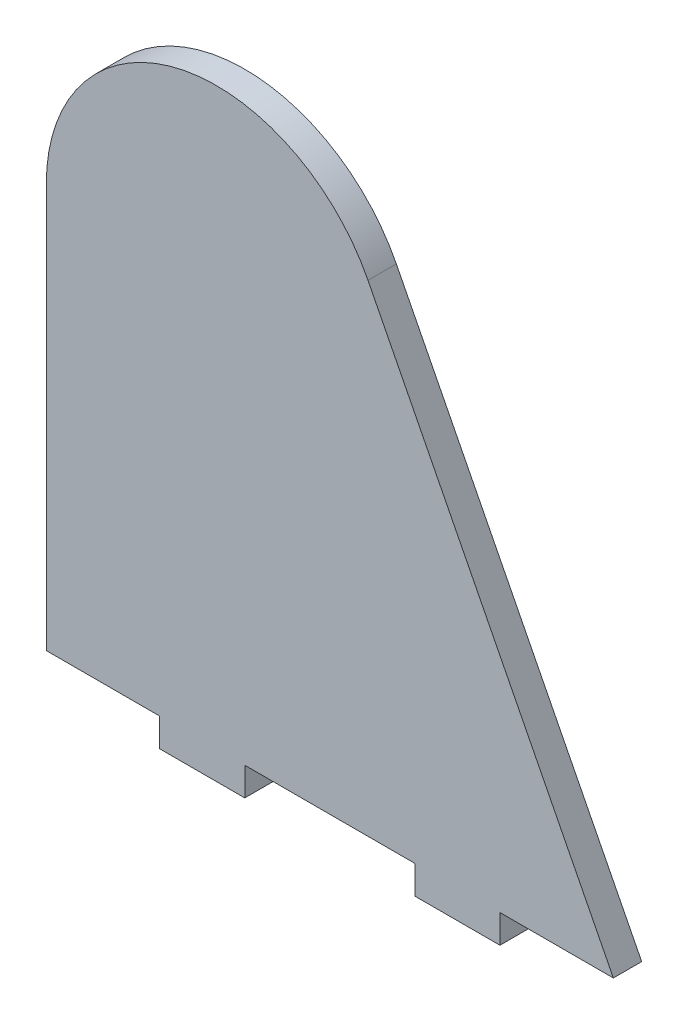
ISO-10303-21;
HEADER;
FILE_DESCRIPTION(('STEP AP214'),'2;1');
FILE_NAME('part.step','',(''),(''),'','','');
FILE_SCHEMA(('AUTOMOTIVE_DESIGN { 1 0 10303 214 1 1 1 1 }'));
ENDSEC;
DATA;
#1=APPLICATION_CONTEXT('core data for automotive mechanical design processes');
#2=APPLICATION_PROTOCOL_DEFINITION('international standard','automotive_design',2000,#1);
#3=PRODUCT_CONTEXT('',#1,'mechanical');
#4=PRODUCT('Part','Part','',(#3));
#5=PRODUCT_RELATED_PRODUCT_CATEGORY('part','',(#4));
#6=PRODUCT_DEFINITION_FORMATION('','',#4);
#7=PRODUCT_DEFINITION_CONTEXT('part definition',#1,'design');
#8=PRODUCT_DEFINITION('design','',#6,#7);
#9=PRODUCT_DEFINITION_SHAPE('','',#8);
#10=(LENGTH_UNIT() NAMED_UNIT(*) SI_UNIT(.MILLI.,.METRE.));
#11=(NAMED_UNIT(*) PLANE_ANGLE_UNIT() SI_UNIT($,.RADIAN.));
#12=(NAMED_UNIT(*) SI_UNIT($,.STERADIAN.) SOLID_ANGLE_UNIT());
#13=UNCERTAINTY_MEASURE_WITH_UNIT(LENGTH_MEASURE(1.E-05),#10,'distance_accuracy_value','');
#14=(GEOMETRIC_REPRESENTATION_CONTEXT(3) GLOBAL_UNCERTAINTY_ASSIGNED_CONTEXT((#13)) GLOBAL_UNIT_ASSIGNED_CONTEXT((#10,
#11,#12)) REPRESENTATION_CONTEXT('',''));
#15=CARTESIAN_POINT('',(0.,0.,0.));
#16=DIRECTION('',(0.,0.,1.));
#17=DIRECTION('',(1.,0.,0.));
#18=AXIS2_PLACEMENT_3D('',#15,#16,#17);
#19=CARTESIAN_POINT('',(0.,0.,5.));
#20=DIRECTION('',(0.,1.,0.));
#21=DIRECTION('',(0.,0.,1.));
#22=AXIS2_PLACEMENT_3D('',#19,#20,#21);
#23=PLANE('',#22);
#24=DIRECTION('',(1.,0.,0.));
#25=VECTOR('',#24,1.);
#26=CARTESIAN_POINT('',(0.,0.,0.));
#27=LINE('',#26,#25);
#28=CARTESIAN_POINT('',(0.,0.,0.));
#29=VERTEX_POINT('',#28);
#30=CARTESIAN_POINT('',(20.,0.,0.));
#31=VERTEX_POINT('',#30);
#32=EDGE_CURVE('E153',#29,#31,#27,.T.);
#33=ORIENTED_EDGE('',*,*,#32,.T.);
#34=DIRECTION('',(0.,0.,-1.));
#35=VECTOR('',#34,1.);
#36=CARTESIAN_POINT('',(20.,0.,5.));
#37=LINE('',#36,#35);
#38=CARTESIAN_POINT('',(20.,0.,5.));
#39=VERTEX_POINT('',#38);
#40=EDGE_CURVE('E11',#39,#31,#37,.T.);
#41=ORIENTED_EDGE('',*,*,#40,.F.);
#42=DIRECTION('',(1.,0.,0.));
#43=VECTOR('',#42,1.);
#44=CARTESIAN_POINT('',(0.,0.,5.));
#45=LINE('',#44,#43);
#46=CARTESIAN_POINT('',(0.,0.,5.));
#47=VERTEX_POINT('',#46);
#48=EDGE_CURVE('E175',#47,#39,#45,.T.);
#49=ORIENTED_EDGE('',*,*,#48,.F.);
#50=DIRECTION('',(0.,0.,-1.));
#51=VECTOR('',#50,1.);
#52=CARTESIAN_POINT('',(0.,0.,5.));
#53=LINE('',#52,#51);
#54=EDGE_CURVE('E149',#47,#29,#53,.T.);
#55=ORIENTED_EDGE('',*,*,#54,.T.);
#56=EDGE_LOOP('',(#33,#41,#49,#55));
#57=FACE_BOUND('',#56,.T.);
#58=ADVANCED_FACE('F33',(#57),#23,.F.);
#59=CARTESIAN_POINT('',(20.,0.,5.));
#60=DIRECTION('',(1.,0.,0.));
#61=DIRECTION('',(0.,0.,-1.));
#62=AXIS2_PLACEMENT_3D('',#59,#60,#61);
#63=PLANE('',#62);
#64=DIRECTION('',(0.,-1.,0.));
#65=VECTOR('',#64,1.);
#66=CARTESIAN_POINT('',(20.,0.,0.));
#67=LINE('',#66,#65);
#68=CARTESIAN_POINT('',(20.,-5.,0.));
#69=VERTEX_POINT('',#68);
#70=EDGE_CURVE('E156',#31,#69,#67,.T.);
#71=ORIENTED_EDGE('',*,*,#70,.T.);
#72=DIRECTION('',(0.,0.,-1.));
#73=VECTOR('',#72,1.);
#74=CARTESIAN_POINT('',(20.,-5.,5.));
#75=LINE('',#74,#73);
#76=CARTESIAN_POINT('',(20.,-5.,5.));
#77=VERTEX_POINT('',#76);
#78=EDGE_CURVE('E41',#77,#69,#75,.T.);
#79=ORIENTED_EDGE('',*,*,#78,.F.);
#80=DIRECTION('',(0.,-1.,0.));
#81=VECTOR('',#80,1.);
#82=CARTESIAN_POINT('',(20.,0.,5.));
#83=LINE('',#82,#81);
#84=EDGE_CURVE('E104',#39,#77,#83,.T.);
#85=ORIENTED_EDGE('',*,*,#84,.F.);
#86=ORIENTED_EDGE('',*,*,#40,.T.);
#87=EDGE_LOOP('',(#71,#79,#85,#86));
#88=FACE_BOUND('',#87,.T.);
#89=ADVANCED_FACE('F253',(#88),#63,.F.);
#90=CARTESIAN_POINT('',(20.,-5.,5.));
#91=DIRECTION('',(0.,1.,0.));
#92=DIRECTION('',(0.,0.,1.));
#93=AXIS2_PLACEMENT_3D('',#90,#91,#92);
#94=PLANE('',#93);
#95=DIRECTION('',(1.,0.,0.));
#96=VECTOR('',#95,1.);
#97=CARTESIAN_POINT('',(20.,-5.,0.));
#98=LINE('',#97,#96);
#99=CARTESIAN_POINT('',(35.,-5.,0.));
#100=VERTEX_POINT('',#99);
#101=EDGE_CURVE('E158',#69,#100,#98,.T.);
#102=ORIENTED_EDGE('',*,*,#101,.T.);
#103=DIRECTION('',(0.,0.,-1.));
#104=VECTOR('',#103,1.);
#105=CARTESIAN_POINT('',(35.,-5.,5.));
#106=LINE('',#105,#104);
#107=CARTESIAN_POINT('',(35.,-5.,5.));
#108=VERTEX_POINT('',#107);
#109=EDGE_CURVE('E194',#108,#100,#106,.T.);
#110=ORIENTED_EDGE('',*,*,#109,.F.);
#111=DIRECTION('',(1.,0.,0.));
#112=VECTOR('',#111,1.);
#113=CARTESIAN_POINT('',(20.,-5.,5.));
#114=LINE('',#113,#112);
#115=EDGE_CURVE('E202',#77,#108,#114,.T.);
#116=ORIENTED_EDGE('',*,*,#115,.F.);
#117=ORIENTED_EDGE('',*,*,#78,.T.);
#118=EDGE_LOOP('',(#102,#110,#116,#117));
#119=FACE_BOUND('',#118,.T.);
#120=ADVANCED_FACE('F200',(#119),#94,.F.);
#121=CARTESIAN_POINT('',(35.,0.,5.));
#122=DIRECTION('',(-1.,0.,0.));
#123=DIRECTION('',(0.,0.,1.));
#124=AXIS2_PLACEMENT_3D('',#121,#122,#123);
#125=PLANE('',#124);
#126=DIRECTION('',(0.,1.,0.));
#127=VECTOR('',#126,1.);
#128=CARTESIAN_POINT('',(35.,0.,0.));
#129=LINE('',#128,#127);
#130=CARTESIAN_POINT('',(35.,0.,0.));
#131=VERTEX_POINT('',#130);
#132=EDGE_CURVE('E160',#100,#131,#129,.T.);
#133=ORIENTED_EDGE('',*,*,#132,.T.);
#134=DIRECTION('',(0.,0.,-1.));
#135=VECTOR('',#134,1.);
#136=CARTESIAN_POINT('',(35.,0.,5.));
#137=LINE('',#136,#135);
#138=CARTESIAN_POINT('',(35.,0.,5.));
#139=VERTEX_POINT('',#138);
#140=EDGE_CURVE('E191',#139,#131,#137,.T.);
#141=ORIENTED_EDGE('',*,*,#140,.F.);
#142=DIRECTION('',(0.,1.,0.));
#143=VECTOR('',#142,1.);
#144=CARTESIAN_POINT('',(35.,0.,5.));
#145=LINE('',#144,#143);
#146=EDGE_CURVE('E220',#108,#139,#145,.T.);
#147=ORIENTED_EDGE('',*,*,#146,.F.);
#148=ORIENTED_EDGE('',*,*,#109,.T.);
#149=EDGE_LOOP('',(#133,#141,#147,#148));
#150=FACE_BOUND('',#149,.T.);
#151=ADVANCED_FACE('F211',(#150),#125,.F.);
#152=CARTESIAN_POINT('',(35.,0.,5.));
#153=DIRECTION('',(0.,1.,0.));
#154=DIRECTION('',(0.,0.,1.));
#155=AXIS2_PLACEMENT_3D('',#152,#153,#154);
#156=PLANE('',#155);
#157=DIRECTION('',(1.,0.,0.));
#158=VECTOR('',#157,1.);
#159=CARTESIAN_POINT('',(35.,0.,0.));
#160=LINE('',#159,#158);
#161=CARTESIAN_POINT('',(65.,0.,0.));
#162=VERTEX_POINT('',#161);
#163=EDGE_CURVE('E162',#131,#162,#160,.T.);
#164=ORIENTED_EDGE('',*,*,#163,.T.);
#165=DIRECTION('',(0.,0.,-1.));
#166=VECTOR('',#165,1.);
#167=CARTESIAN_POINT('',(65.,0.,5.));
#168=LINE('',#167,#166);
#169=CARTESIAN_POINT('',(65.,0.,5.));
#170=VERTEX_POINT('',#169);
#171=EDGE_CURVE('E188',#170,#162,#168,.T.);
#172=ORIENTED_EDGE('',*,*,#171,.F.);
#173=DIRECTION('',(1.,0.,0.));
#174=VECTOR('',#173,1.);
#175=CARTESIAN_POINT('',(35.,0.,5.));
#176=LINE('',#175,#174);
#177=EDGE_CURVE('E217',#139,#170,#176,.T.);
#178=ORIENTED_EDGE('',*,*,#177,.F.);
#179=ORIENTED_EDGE('',*,*,#140,.T.);
#180=EDGE_LOOP('',(#164,#172,#178,#179));
#181=FACE_BOUND('',#180,.T.);
#182=ADVANCED_FACE('F215',(#181),#156,.F.);
#183=CARTESIAN_POINT('',(65.,0.,5.));
#184=DIRECTION('',(1.,0.,0.));
#185=DIRECTION('',(0.,0.,-1.));
#186=AXIS2_PLACEMENT_3D('',#183,#184,#185);
#187=PLANE('',#186);
#188=DIRECTION('',(0.,-1.,0.));
#189=VECTOR('',#188,1.);
#190=CARTESIAN_POINT('',(65.,0.,0.));
#191=LINE('',#190,#189);
#192=CARTESIAN_POINT('',(65.,-5.,0.));
#193=VERTEX_POINT('',#192);
#194=EDGE_CURVE('E164',#162,#193,#191,.T.);
#195=ORIENTED_EDGE('',*,*,#194,.T.);
#196=DIRECTION('',(0.,0.,-1.));
#197=VECTOR('',#196,1.);
#198=CARTESIAN_POINT('',(65.,-5.,5.));
#199=LINE('',#198,#197);
#200=CARTESIAN_POINT('',(65.,-5.,5.));
#201=VERTEX_POINT('',#200);
#202=EDGE_CURVE('E185',#201,#193,#199,.T.);
#203=ORIENTED_EDGE('',*,*,#202,.F.);
#204=DIRECTION('',(0.,-1.,0.));
#205=VECTOR('',#204,1.);
#206=CARTESIAN_POINT('',(65.,0.,5.));
#207=LINE('',#206,#205);
#208=EDGE_CURVE('E219',#170,#201,#207,.T.);
#209=ORIENTED_EDGE('',*,*,#208,.F.);
#210=ORIENTED_EDGE('',*,*,#171,.T.);
#211=EDGE_LOOP('',(#195,#203,#209,#210));
#212=FACE_BOUND('',#211,.T.);
#213=ADVANCED_FACE('F266',(#212),#187,.F.);
#214=CARTESIAN_POINT('',(65.,-5.,5.));
#215=DIRECTION('',(0.,1.,0.));
#216=DIRECTION('',(0.,0.,1.));
#217=AXIS2_PLACEMENT_3D('',#214,#215,#216);
#218=PLANE('',#217);
#219=DIRECTION('',(1.,0.,0.));
#220=VECTOR('',#219,1.);
#221=CARTESIAN_POINT('',(65.,-5.,0.));
#222=LINE('',#221,#220);
#223=CARTESIAN_POINT('',(80.,-5.,0.));
#224=VERTEX_POINT('',#223);
#225=EDGE_CURVE('E166',#193,#224,#222,.T.);
#226=ORIENTED_EDGE('',*,*,#225,.T.);
#227=DIRECTION('',(0.,0.,-1.));
#228=VECTOR('',#227,1.);
#229=CARTESIAN_POINT('',(80.,-5.,5.));
#230=LINE('',#229,#228);
#231=CARTESIAN_POINT('',(80.,-5.,5.));
#232=VERTEX_POINT('',#231);
#233=EDGE_CURVE('E182',#232,#224,#230,.T.);
#234=ORIENTED_EDGE('',*,*,#233,.F.);
#235=DIRECTION('',(1.,0.,0.));
#236=VECTOR('',#235,1.);
#237=CARTESIAN_POINT('',(65.,-5.,5.));
#238=LINE('',#237,#236);
#239=EDGE_CURVE('E222',#201,#232,#238,.T.);
#240=ORIENTED_EDGE('',*,*,#239,.F.);
#241=ORIENTED_EDGE('',*,*,#202,.T.);
#242=EDGE_LOOP('',(#226,#234,#240,#241));
#243=FACE_BOUND('',#242,.T.);
#244=ADVANCED_FACE('F269',(#243),#218,.F.);
#245=CARTESIAN_POINT('',(80.,0.,5.));
#246=DIRECTION('',(-1.,0.,0.));
#247=DIRECTION('',(0.,0.,1.));
#248=AXIS2_PLACEMENT_3D('',#245,#246,#247);
#249=PLANE('',#248);
#250=DIRECTION('',(0.,1.,0.));
#251=VECTOR('',#250,1.);
#252=CARTESIAN_POINT('',(80.,0.,0.));
#253=LINE('',#252,#251);
#254=CARTESIAN_POINT('',(80.,0.,0.));
#255=VERTEX_POINT('',#254);
#256=EDGE_CURVE('E168',#224,#255,#253,.T.);
#257=ORIENTED_EDGE('',*,*,#256,.T.);
#258=DIRECTION('',(0.,0.,-1.));
#259=VECTOR('',#258,1.);
#260=CARTESIAN_POINT('',(80.,0.,5.));
#261=LINE('',#260,#259);
#262=CARTESIAN_POINT('',(80.,0.,5.));
#263=VERTEX_POINT('',#262);
#264=EDGE_CURVE('E179',#263,#255,#261,.T.);
#265=ORIENTED_EDGE('',*,*,#264,.F.);
#266=DIRECTION('',(0.,1.,0.));
#267=VECTOR('',#266,1.);
#268=CARTESIAN_POINT('',(80.,0.,5.));
#269=LINE('',#268,#267);
#270=EDGE_CURVE('E228',#232,#263,#269,.T.);
#271=ORIENTED_EDGE('',*,*,#270,.F.);
#272=ORIENTED_EDGE('',*,*,#233,.T.);
#273=EDGE_LOOP('',(#257,#265,#271,#272));
#274=FACE_BOUND('',#273,.T.);
#275=ADVANCED_FACE('F234',(#274),#249,.F.);
#276=CARTESIAN_POINT('',(80.,0.,5.));
#277=DIRECTION('',(0.,1.,0.));
#278=DIRECTION('',(0.,0.,1.));
#279=AXIS2_PLACEMENT_3D('',#276,#277,#278);
#280=PLANE('',#279);
#281=DIRECTION('',(1.,0.,0.));
#282=VECTOR('',#281,1.);
#283=CARTESIAN_POINT('',(80.,0.,0.));
#284=LINE('',#283,#282);
#285=CARTESIAN_POINT('',(100.,0.,0.));
#286=VERTEX_POINT('',#285);
#287=EDGE_CURVE('E170',#255,#286,#284,.T.);
#288=ORIENTED_EDGE('',*,*,#287,.T.);
#289=DIRECTION('',(0.,0.,-1.));
#290=VECTOR('',#289,1.);
#291=CARTESIAN_POINT('',(100.,0.,5.));
#292=LINE('',#291,#290);
#293=CARTESIAN_POINT('',(100.,0.,5.));
#294=VERTEX_POINT('',#293);
#295=EDGE_CURVE('E144',#294,#286,#292,.T.);
#296=ORIENTED_EDGE('',*,*,#295,.F.);
#297=DIRECTION('',(1.,0.,0.));
#298=VECTOR('',#297,1.);
#299=CARTESIAN_POINT('',(80.,0.,5.));
#300=LINE('',#299,#298);
#301=EDGE_CURVE('E135',#263,#294,#300,.T.);
#302=ORIENTED_EDGE('',*,*,#301,.F.);
#303=ORIENTED_EDGE('',*,*,#264,.T.);
#304=EDGE_LOOP('',(#288,#296,#302,#303));
#305=FACE_BOUND('',#304,.T.);
#306=ADVANCED_FACE('F238',(#305),#280,.F.);
#307=CARTESIAN_POINT('',(100.,0.,5.));
#308=DIRECTION('',(-0.891006524188366,-0.453990499739551,0.));
#309=DIRECTION('',(0.453990499739551,-0.891006524188366,0.));
#310=AXIS2_PLACEMENT_3D('',#307,#308,#309);
#311=PLANE('',#310);
#312=DIRECTION('',(-0.453990499739551,0.891006524188366,0.));
#313=VECTOR('',#312,1.);
#314=CARTESIAN_POINT('',(100.,0.,0.));
#315=LINE('',#314,#313);
#316=CARTESIAN_POINT('',(56.730195725651,84.9217724399881,0.));
#317=VERTEX_POINT('',#316);
#318=EDGE_CURVE('E143',#286,#317,#315,.T.);
#319=ORIENTED_EDGE('',*,*,#318,.T.);
#320=DIRECTION('',(0.,0.,-1.));
#321=VECTOR('',#320,1.);
#322=CARTESIAN_POINT('',(56.730195725651,84.9217724399881,5.));
#323=LINE('',#322,#321);
#324=CARTESIAN_POINT('',(56.730195725651,84.9217724399881,5.));
#325=VERTEX_POINT('',#324);
#326=EDGE_CURVE('E140',#325,#317,#323,.T.);
#327=ORIENTED_EDGE('',*,*,#326,.F.);
#328=DIRECTION('',(-0.453990499739551,0.891006524188366,0.));
#329=VECTOR('',#328,1.);
#330=CARTESIAN_POINT('',(100.,0.,5.));
#331=LINE('',#330,#329);
#332=EDGE_CURVE('E129',#294,#325,#331,.T.);
#333=ORIENTED_EDGE('',*,*,#332,.F.);
#334=ORIENTED_EDGE('',*,*,#295,.T.);
#335=EDGE_LOOP('',(#319,#327,#333,#334));
#336=FACE_BOUND('',#335,.T.);
#337=ADVANCED_FACE('F141',(#336),#311,.F.);
#338=CARTESIAN_POINT('',(30.,71.3020574478016,5.));
#339=DIRECTION('',(0.,0.,-1.));
#340=DIRECTION('',(-1.,0.,0.));
#341=AXIS2_PLACEMENT_3D('',#338,#339,#340);
#342=CYLINDRICAL_SURFACE('',#341,30.);
#343=CARTESIAN_POINT('',(30.,71.3020574478016,0.));
#344=DIRECTION('',(0.,0.,1.));
#345=DIRECTION('',(-1.,0.,0.));
#346=AXIS2_PLACEMENT_3D('',#343,#344,#345);
#347=CIRCLE('',#346,30.);
#348=CARTESIAN_POINT('',(0.,71.3020574478016,0.));
#349=VERTEX_POINT('',#348);
#350=EDGE_CURVE('E90',#317,#349,#347,.T.);
#351=ORIENTED_EDGE('',*,*,#350,.T.);
#352=DIRECTION('',(0.,0.,-1.));
#353=VECTOR('',#352,1.);
#354=CARTESIAN_POINT('',(0.,71.3020574478016,5.));
#355=LINE('',#354,#353);
#356=CARTESIAN_POINT('',(0.,71.3020574478016,5.));
#357=VERTEX_POINT('',#356);
#358=EDGE_CURVE('E145',#357,#349,#355,.T.);
#359=ORIENTED_EDGE('',*,*,#358,.F.);
#360=CARTESIAN_POINT('',(30.,71.3020574478016,5.));
#361=DIRECTION('',(0.,0.,1.));
#362=DIRECTION('',(-1.,0.,0.));
#363=AXIS2_PLACEMENT_3D('',#360,#361,#362);
#364=CIRCLE('',#363,30.);
#365=EDGE_CURVE('E133',#325,#357,#364,.T.);
#366=ORIENTED_EDGE('',*,*,#365,.F.);
#367=ORIENTED_EDGE('',*,*,#326,.T.);
#368=EDGE_LOOP('',(#351,#359,#366,#367));
#369=FACE_BOUND('',#368,.T.);
#370=ADVANCED_FACE('F147',(#369),#342,.T.);
#371=CARTESIAN_POINT('',(0.,71.3020574478016,5.));
#372=DIRECTION('',(1.,0.,0.));
#373=DIRECTION('',(0.,1.,0.));
#374=AXIS2_PLACEMENT_3D('',#371,#372,#373);
#375=PLANE('',#374);
#376=DIRECTION('',(0.,-1.,0.));
#377=VECTOR('',#376,1.);
#378=CARTESIAN_POINT('',(0.,71.3020574478016,0.));
#379=LINE('',#378,#377);
#380=EDGE_CURVE('E96',#349,#29,#379,.T.);
#381=ORIENTED_EDGE('',*,*,#380,.T.);
#382=ORIENTED_EDGE('',*,*,#54,.F.);
#383=DIRECTION('',(0.,-1.,0.));
#384=VECTOR('',#383,1.);
#385=CARTESIAN_POINT('',(0.,71.3020574478016,5.));
#386=LINE('',#385,#384);
#387=EDGE_CURVE('E49',#357,#47,#386,.T.);
#388=ORIENTED_EDGE('',*,*,#387,.F.);
#389=ORIENTED_EDGE('',*,*,#358,.T.);
#390=EDGE_LOOP('',(#381,#382,#388,#389));
#391=FACE_BOUND('',#390,.T.);
#392=ADVANCED_FACE('F242',(#391),#375,.F.);
#393=CARTESIAN_POINT('',(30.,71.3020574478016,5.));
#394=DIRECTION('',(0.,0.,-1.));
#395=DIRECTION('',(-1.,0.,0.));
#396=AXIS2_PLACEMENT_3D('',#393,#394,#395);
#397=PLANE('',#396);
#398=ORIENTED_EDGE('',*,*,#48,.T.);
#399=ORIENTED_EDGE('',*,*,#84,.T.);
#400=ORIENTED_EDGE('',*,*,#115,.T.);
#401=ORIENTED_EDGE('',*,*,#146,.T.);
#402=ORIENTED_EDGE('',*,*,#177,.T.);
#403=ORIENTED_EDGE('',*,*,#208,.T.);
#404=ORIENTED_EDGE('',*,*,#239,.T.);
#405=ORIENTED_EDGE('',*,*,#270,.T.);
#406=ORIENTED_EDGE('',*,*,#301,.T.);
#407=ORIENTED_EDGE('',*,*,#332,.T.);
#408=ORIENTED_EDGE('',*,*,#365,.T.);
#409=ORIENTED_EDGE('',*,*,#387,.T.);
#410=EDGE_LOOP('',(#398,#399,#400,#401,#402,#403,#404,#405,#406,#407,#408,#409));
#411=FACE_BOUND('',#410,.T.);
#412=ADVANCED_FACE('F131',(#411),#397,.F.);
#413=CARTESIAN_POINT('',(30.,71.3020574478016,0.));
#414=DIRECTION('',(0.,0.,-1.));
#415=DIRECTION('',(-1.,0.,0.));
#416=AXIS2_PLACEMENT_3D('',#413,#414,#415);
#417=PLANE('',#416);
#418=ORIENTED_EDGE('',*,*,#32,.F.);
#419=ORIENTED_EDGE('',*,*,#380,.F.);
#420=ORIENTED_EDGE('',*,*,#350,.F.);
#421=ORIENTED_EDGE('',*,*,#318,.F.);
#422=ORIENTED_EDGE('',*,*,#287,.F.);
#423=ORIENTED_EDGE('',*,*,#256,.F.);
#424=ORIENTED_EDGE('',*,*,#225,.F.);
#425=ORIENTED_EDGE('',*,*,#194,.F.);
#426=ORIENTED_EDGE('',*,*,#163,.F.);
#427=ORIENTED_EDGE('',*,*,#132,.F.);
#428=ORIENTED_EDGE('',*,*,#101,.F.);
#429=ORIENTED_EDGE('',*,*,#70,.F.);
#430=EDGE_LOOP('',(#418,#419,#420,#421,#422,#423,#424,#425,#426,#427,#428,#429));
#431=FACE_BOUND('',#430,.T.);
#432=ADVANCED_FACE('F206',(#431),#417,.T.);
#433=CLOSED_SHELL('',(#58,#89,#120,#151,#182,#213,#244,#275,#306,#337,#370,#392,#412,#432));
#434=MANIFOLD_SOLID_BREP('B2',#433);
#435=ADVANCED_BREP_SHAPE_REPRESENTATION('',(#18,#434),#14);
#436=SHAPE_DEFINITION_REPRESENTATION(#9,#435);
ENDSEC;
END-ISO-10303-21;
